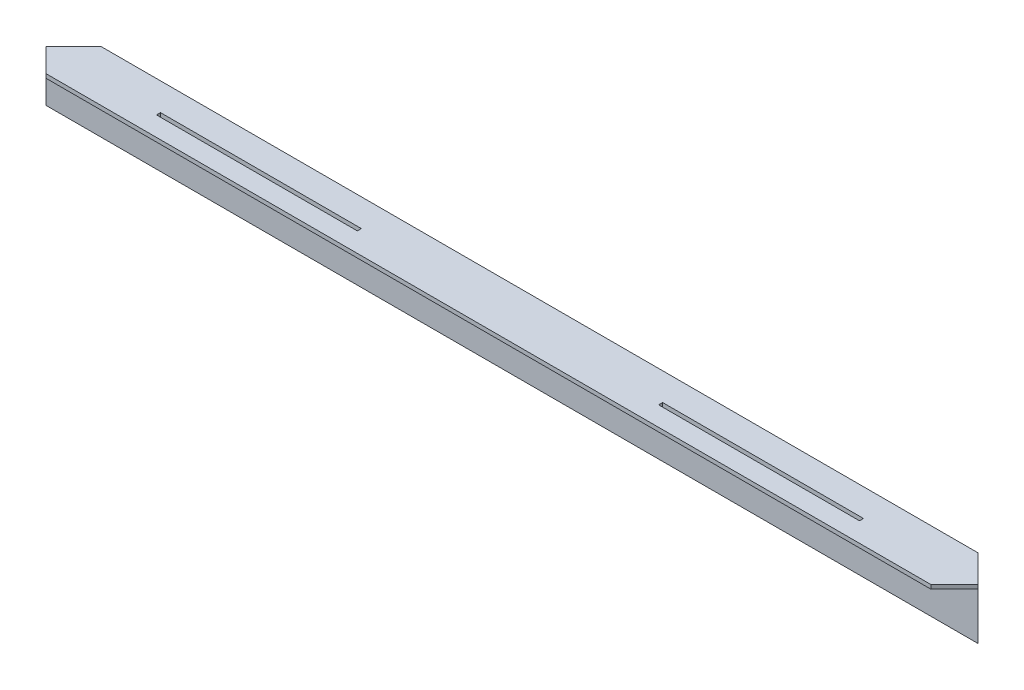
ISO-10303-21;
HEADER;
FILE_DESCRIPTION(('STEP AP214'),'2;1');
FILE_NAME('part.step','',(''),(''),'','','');
FILE_SCHEMA(('AUTOMOTIVE_DESIGN { 1 0 10303 214 1 1 1 1 }'));
ENDSEC;
DATA;
#1=APPLICATION_CONTEXT('core data for automotive mechanical design processes');
#2=APPLICATION_PROTOCOL_DEFINITION('international standard','automotive_design',2000,#1);
#3=PRODUCT_CONTEXT('',#1,'mechanical');
#4=PRODUCT('Part','Part','',(#3));
#5=PRODUCT_RELATED_PRODUCT_CATEGORY('part','',(#4));
#6=PRODUCT_DEFINITION_FORMATION('','',#4);
#7=PRODUCT_DEFINITION_CONTEXT('part definition',#1,'design');
#8=PRODUCT_DEFINITION('design','',#6,#7);
#9=PRODUCT_DEFINITION_SHAPE('','',#8);
#10=(LENGTH_UNIT() NAMED_UNIT(*) SI_UNIT(.MILLI.,.METRE.));
#11=(NAMED_UNIT(*) PLANE_ANGLE_UNIT() SI_UNIT($,.RADIAN.));
#12=(NAMED_UNIT(*) SI_UNIT($,.STERADIAN.) SOLID_ANGLE_UNIT());
#13=UNCERTAINTY_MEASURE_WITH_UNIT(LENGTH_MEASURE(1.E-05),#10,'distance_accuracy_value','');
#14=(GEOMETRIC_REPRESENTATION_CONTEXT(3) GLOBAL_UNCERTAINTY_ASSIGNED_CONTEXT((#13)) GLOBAL_UNIT_ASSIGNED_CONTEXT((#10,
#11,#12)) REPRESENTATION_CONTEXT('',''));
#15=CARTESIAN_POINT('',(0.,0.,0.));
#16=DIRECTION('',(0.,0.,1.));
#17=DIRECTION('',(1.,0.,0.));
#18=AXIS2_PLACEMENT_3D('',#15,#16,#17);
#19=CARTESIAN_POINT('',(232.,0.,168.3));
#20=DIRECTION('',(0.,0.,1.));
#21=DIRECTION('',(1.,0.,0.));
#22=AXIS2_PLACEMENT_3D('',#19,#20,#21);
#23=PLANE('',#22);
#24=DIRECTION('',(-1.,0.,0.));
#25=VECTOR('',#24,1.);
#26=CARTESIAN_POINT('',(232.,-2.,168.3));
#27=LINE('',#26,#25);
#28=CARTESIAN_POINT('',(218.3,-2.,168.3));
#29=VERTEX_POINT('',#28);
#30=CARTESIAN_POINT('',(-218.3,-2.,168.3));
#31=VERTEX_POINT('',#30);
#32=EDGE_CURVE('E191',#29,#31,#27,.T.);
#33=ORIENTED_EDGE('',*,*,#32,.T.);
#34=DIRECTION('',(0.,1.,0.));
#35=VECTOR('',#34,1.);
#36=CARTESIAN_POINT('',(-218.3,-50.,168.3));
#37=LINE('',#36,#35);
#38=CARTESIAN_POINT('',(-218.3,0.,168.3));
#39=VERTEX_POINT('',#38);
#40=EDGE_CURVE('E250',#31,#39,#37,.T.);
#41=ORIENTED_EDGE('',*,*,#40,.T.);
#42=DIRECTION('',(-1.,0.,0.));
#43=VECTOR('',#42,1.);
#44=CARTESIAN_POINT('',(232.,0.,168.3));
#45=LINE('',#44,#43);
#46=CARTESIAN_POINT('',(218.3,0.,168.3));
#47=VERTEX_POINT('',#46);
#48=EDGE_CURVE('E212',#47,#39,#45,.T.);
#49=ORIENTED_EDGE('',*,*,#48,.F.);
#50=DIRECTION('',(0.,1.,0.));
#51=VECTOR('',#50,1.);
#52=CARTESIAN_POINT('',(218.3,-50.,168.3));
#53=LINE('',#52,#51);
#54=EDGE_CURVE('E179',#29,#47,#53,.T.);
#55=ORIENTED_EDGE('',*,*,#54,.F.);
#56=EDGE_LOOP('',(#33,#41,#49,#55));
#57=FACE_BOUND('',#56,.T.);
#58=ADVANCED_FACE('F33',(#57),#23,.F.);
#59=CARTESIAN_POINT('',(232.,0.,193.7));
#60=DIRECTION('',(0.,-1.,0.));
#61=DIRECTION('',(0.,0.,-1.));
#62=AXIS2_PLACEMENT_3D('',#59,#60,#61);
#63=PLANE('',#62);
#64=DIRECTION('',(0.,0.,1.));
#65=VECTOR('',#64,1.);
#66=CARTESIAN_POINT('',(-175.,0.,182.));
#67=LINE('',#66,#65);
#68=CARTESIAN_POINT('',(-175.,0.,182.));
#69=VERTEX_POINT('',#68);
#70=CARTESIAN_POINT('',(-175.,0.,184.));
#71=VERTEX_POINT('',#70);
#72=EDGE_CURVE('E375',#69,#71,#67,.T.);
#73=ORIENTED_EDGE('',*,*,#72,.F.);
#74=DIRECTION('',(-1.,0.,0.));
#75=VECTOR('',#74,1.);
#76=CARTESIAN_POINT('',(-75.,0.,182.));
#77=LINE('',#76,#75);
#78=CARTESIAN_POINT('',(-75.,0.,182.));
#79=VERTEX_POINT('',#78);
#80=EDGE_CURVE('E47',#79,#69,#77,.T.);
#81=ORIENTED_EDGE('',*,*,#80,.F.);
#82=DIRECTION('',(0.,0.,-1.));
#83=VECTOR('',#82,1.);
#84=CARTESIAN_POINT('',(-75.,0.,182.));
#85=LINE('',#84,#83);
#86=CARTESIAN_POINT('',(-75.,0.,184.));
#87=VERTEX_POINT('',#86);
#88=EDGE_CURVE('E306',#87,#79,#85,.T.);
#89=ORIENTED_EDGE('',*,*,#88,.F.);
#90=DIRECTION('',(1.,0.,0.));
#91=VECTOR('',#90,1.);
#92=CARTESIAN_POINT('',(-175.,0.,184.));
#93=LINE('',#92,#91);
#94=EDGE_CURVE('E297',#71,#87,#93,.T.);
#95=ORIENTED_EDGE('',*,*,#94,.F.);
#96=EDGE_LOOP('',(#73,#81,#89,#95));
#97=FACE_BOUND('',#96,.T.);
#98=DIRECTION('',(1.,0.,0.));
#99=VECTOR('',#98,1.);
#100=CARTESIAN_POINT('',(175.,0.,184.));
#101=LINE('',#100,#99);
#102=CARTESIAN_POINT('',(75.,0.,184.));
#103=VERTEX_POINT('',#102);
#104=CARTESIAN_POINT('',(175.,0.,184.));
#105=VERTEX_POINT('',#104);
#106=EDGE_CURVE('E308',#103,#105,#101,.T.);
#107=ORIENTED_EDGE('',*,*,#106,.F.);
#108=DIRECTION('',(0.,0.,1.));
#109=VECTOR('',#108,1.);
#110=CARTESIAN_POINT('',(75.,0.,182.));
#111=LINE('',#110,#109);
#112=CARTESIAN_POINT('',(75.,0.,182.));
#113=VERTEX_POINT('',#112);
#114=EDGE_CURVE('E55',#113,#103,#111,.T.);
#115=ORIENTED_EDGE('',*,*,#114,.F.);
#116=DIRECTION('',(-1.,0.,0.));
#117=VECTOR('',#116,1.);
#118=CARTESIAN_POINT('',(75.,0.,182.));
#119=LINE('',#118,#117);
#120=CARTESIAN_POINT('',(175.,0.,182.));
#121=VERTEX_POINT('',#120);
#122=EDGE_CURVE('E232',#121,#113,#119,.T.);
#123=ORIENTED_EDGE('',*,*,#122,.F.);
#124=DIRECTION('',(0.,0.,-1.));
#125=VECTOR('',#124,1.);
#126=CARTESIAN_POINT('',(175.,0.,182.));
#127=LINE('',#126,#125);
#128=EDGE_CURVE('E237',#105,#121,#127,.T.);
#129=ORIENTED_EDGE('',*,*,#128,.F.);
#130=EDGE_LOOP('',(#107,#115,#123,#129));
#131=FACE_BOUND('',#130,.T.);
#132=DIRECTION('',(-0.707106781186548,0.,0.707106781186548));
#133=VECTOR('',#132,1.);
#134=CARTESIAN_POINT('',(-5.84999999999999,0.,-44.15));
#135=LINE('',#134,#133);
#136=CARTESIAN_POINT('',(-232.,0.,182.));
#137=VERTEX_POINT('',#136);
#138=EDGE_CURVE('E263',#39,#137,#135,.T.);
#139=ORIENTED_EDGE('',*,*,#138,.T.);
#140=DIRECTION('',(0.707106781186547,0.,0.707106781186547));
#141=VECTOR('',#140,1.);
#142=CARTESIAN_POINT('',(5.84999999999999,0.,419.85));
#143=LINE('',#142,#141);
#144=CARTESIAN_POINT('',(-220.3,0.,193.7));
#145=VERTEX_POINT('',#144);
#146=EDGE_CURVE('E309',#137,#145,#143,.T.);
#147=ORIENTED_EDGE('',*,*,#146,.T.);
#148=DIRECTION('',(-1.,0.,0.));
#149=VECTOR('',#148,1.);
#150=CARTESIAN_POINT('',(232.,0.,193.7));
#151=LINE('',#150,#149);
#152=CARTESIAN_POINT('',(220.3,0.,193.7));
#153=VERTEX_POINT('',#152);
#154=EDGE_CURVE('E174',#153,#145,#151,.T.);
#155=ORIENTED_EDGE('',*,*,#154,.F.);
#156=DIRECTION('',(0.707106781186546,0.,-0.707106781186549));
#157=VECTOR('',#156,1.);
#158=CARTESIAN_POINT('',(226.15,0.,187.85));
#159=LINE('',#158,#157);
#160=CARTESIAN_POINT('',(232.,0.,182.));
#161=VERTEX_POINT('',#160);
#162=EDGE_CURVE('E155',#153,#161,#159,.T.);
#163=ORIENTED_EDGE('',*,*,#162,.T.);
#164=DIRECTION('',(-0.707106781186548,0.,-0.707106781186548));
#165=VECTOR('',#164,1.);
#166=CARTESIAN_POINT('',(237.85,0.,187.85));
#167=LINE('',#166,#165);
#168=EDGE_CURVE('E170',#161,#47,#167,.T.);
#169=ORIENTED_EDGE('',*,*,#168,.T.);
#170=ORIENTED_EDGE('',*,*,#48,.T.);
#171=EDGE_LOOP('',(#139,#147,#155,#163,#169,#170));
#172=FACE_BOUND('',#171,.T.);
#173=ADVANCED_FACE('F168',(#97,#131,#172),#63,.F.);
#174=CARTESIAN_POINT('',(232.,0.,193.7));
#175=DIRECTION('',(0.,0.,-1.));
#176=DIRECTION('',(-1.,0.,0.));
#177=AXIS2_PLACEMENT_3D('',#174,#175,#176);
#178=PLANE('',#177);
#179=ORIENTED_EDGE('',*,*,#154,.T.);
#180=DIRECTION('',(0.,1.,0.));
#181=VECTOR('',#180,1.);
#182=CARTESIAN_POINT('',(-220.3,-50.,193.7));
#183=LINE('',#182,#181);
#184=CARTESIAN_POINT('',(-220.3,-2.,193.7));
#185=VERTEX_POINT('',#184);
#186=EDGE_CURVE('E379',#185,#145,#183,.T.);
#187=ORIENTED_EDGE('',*,*,#186,.F.);
#188=DIRECTION('',(-1.,0.,0.));
#189=VECTOR('',#188,1.);
#190=CARTESIAN_POINT('',(232.,-2.,193.7));
#191=LINE('',#190,#189);
#192=CARTESIAN_POINT('',(220.3,-2.,193.7));
#193=VERTEX_POINT('',#192);
#194=EDGE_CURVE('E207',#193,#185,#191,.T.);
#195=ORIENTED_EDGE('',*,*,#194,.F.);
#196=DIRECTION('',(0.,1.,0.));
#197=VECTOR('',#196,1.);
#198=CARTESIAN_POINT('',(220.3,-50.,193.7));
#199=LINE('',#198,#197);
#200=EDGE_CURVE('E380',#193,#153,#199,.T.);
#201=ORIENTED_EDGE('',*,*,#200,.T.);
#202=EDGE_LOOP('',(#179,#187,#195,#201));
#203=FACE_BOUND('',#202,.T.);
#204=ADVANCED_FACE('F319',(#203),#178,.F.);
#205=CARTESIAN_POINT('',(232.,-2.,193.7));
#206=DIRECTION('',(0.,1.,0.));
#207=DIRECTION('',(0.,0.,1.));
#208=AXIS2_PLACEMENT_3D('',#205,#206,#207);
#209=PLANE('',#208);
#210=ORIENTED_EDGE('',*,*,#194,.T.);
#211=DIRECTION('',(-0.707106781186548,0.,-0.707106781186548));
#212=VECTOR('',#211,1.);
#213=CARTESIAN_POINT('',(5.84999999999999,-2.,419.85));
#214=LINE('',#213,#212);
#215=CARTESIAN_POINT('',(-232.,-2.,182.));
#216=VERTEX_POINT('',#215);
#217=EDGE_CURVE('E175',#185,#216,#214,.T.);
#218=ORIENTED_EDGE('',*,*,#217,.T.);
#219=DIRECTION('',(-1.,0.,0.));
#220=VECTOR('',#219,1.);
#221=CARTESIAN_POINT('',(232.,-2.,182.));
#222=LINE('',#221,#220);
#223=CARTESIAN_POINT('',(-175.,-2.,182.));
#224=VERTEX_POINT('',#223);
#225=EDGE_CURVE('E203',#224,#216,#222,.T.);
#226=ORIENTED_EDGE('',*,*,#225,.F.);
#227=DIRECTION('',(0.,0.,1.));
#228=VECTOR('',#227,1.);
#229=CARTESIAN_POINT('',(-175.,-2.,193.7));
#230=LINE('',#229,#228);
#231=CARTESIAN_POINT('',(-175.,-2.,184.));
#232=VERTEX_POINT('',#231);
#233=EDGE_CURVE('E244',#224,#232,#230,.T.);
#234=ORIENTED_EDGE('',*,*,#233,.T.);
#235=DIRECTION('',(1.,0.,0.));
#236=VECTOR('',#235,1.);
#237=CARTESIAN_POINT('',(232.,-2.,184.));
#238=LINE('',#237,#236);
#239=CARTESIAN_POINT('',(-75.,-2.,184.));
#240=VERTEX_POINT('',#239);
#241=EDGE_CURVE('E11',#232,#240,#238,.T.);
#242=ORIENTED_EDGE('',*,*,#241,.T.);
#243=DIRECTION('',(0.,0.,-1.));
#244=VECTOR('',#243,1.);
#245=CARTESIAN_POINT('',(-75.,-2.,193.7));
#246=LINE('',#245,#244);
#247=CARTESIAN_POINT('',(-75.,-2.,182.));
#248=VERTEX_POINT('',#247);
#249=EDGE_CURVE('E247',#240,#248,#246,.T.);
#250=ORIENTED_EDGE('',*,*,#249,.T.);
#251=CARTESIAN_POINT('',(75.,-2.,182.));
#252=VERTEX_POINT('',#251);
#253=EDGE_CURVE('E208',#252,#248,#222,.T.);
#254=ORIENTED_EDGE('',*,*,#253,.F.);
#255=DIRECTION('',(0.,0.,1.));
#256=VECTOR('',#255,1.);
#257=CARTESIAN_POINT('',(75.,-2.,193.7));
#258=LINE('',#257,#256);
#259=CARTESIAN_POINT('',(75.,-2.,184.));
#260=VERTEX_POINT('',#259);
#261=EDGE_CURVE('E223',#252,#260,#258,.T.);
#262=ORIENTED_EDGE('',*,*,#261,.T.);
#263=DIRECTION('',(1.,0.,0.));
#264=VECTOR('',#263,1.);
#265=CARTESIAN_POINT('',(232.,-2.,184.));
#266=LINE('',#265,#264);
#267=CARTESIAN_POINT('',(175.,-2.,184.));
#268=VERTEX_POINT('',#267);
#269=EDGE_CURVE('E40',#260,#268,#266,.T.);
#270=ORIENTED_EDGE('',*,*,#269,.T.);
#271=DIRECTION('',(0.,0.,-1.));
#272=VECTOR('',#271,1.);
#273=CARTESIAN_POINT('',(175.,-2.,193.7));
#274=LINE('',#273,#272);
#275=CARTESIAN_POINT('',(175.,-2.,182.));
#276=VERTEX_POINT('',#275);
#277=EDGE_CURVE('E221',#268,#276,#274,.T.);
#278=ORIENTED_EDGE('',*,*,#277,.T.);
#279=CARTESIAN_POINT('',(232.,-2.,182.));
#280=VERTEX_POINT('',#279);
#281=EDGE_CURVE('E204',#280,#276,#222,.T.);
#282=ORIENTED_EDGE('',*,*,#281,.F.);
#283=DIRECTION('',(-0.707106781186546,0.,0.707106781186549));
#284=VECTOR('',#283,1.);
#285=CARTESIAN_POINT('',(226.15,-2.,187.85));
#286=LINE('',#285,#284);
#287=EDGE_CURVE('E158',#280,#193,#286,.T.);
#288=ORIENTED_EDGE('',*,*,#287,.T.);
#289=EDGE_LOOP('',(#210,#218,#226,#234,#242,#250,#254,#262,#270,#278,#282,#288));
#290=FACE_BOUND('',#289,.T.);
#291=ADVANCED_FACE('F219',(#290),#209,.F.);
#292=CARTESIAN_POINT('',(232.,-2.,182.));
#293=DIRECTION('',(0.,0.,-1.));
#294=DIRECTION('',(-1.,0.,0.));
#295=AXIS2_PLACEMENT_3D('',#292,#293,#294);
#296=PLANE('',#295);
#297=ORIENTED_EDGE('',*,*,#281,.T.);
#298=DIRECTION('',(0.,1.,0.));
#299=VECTOR('',#298,1.);
#300=CARTESIAN_POINT('',(175.,-25.4,182.));
#301=LINE('',#300,#299);
#302=EDGE_CURVE('E234',#276,#121,#301,.T.);
#303=ORIENTED_EDGE('',*,*,#302,.T.);
#304=ORIENTED_EDGE('',*,*,#122,.T.);
#305=DIRECTION('',(0.,1.,0.));
#306=VECTOR('',#305,1.);
#307=CARTESIAN_POINT('',(75.,-25.4,182.));
#308=LINE('',#307,#306);
#309=EDGE_CURVE('E287',#252,#113,#308,.T.);
#310=ORIENTED_EDGE('',*,*,#309,.F.);
#311=ORIENTED_EDGE('',*,*,#253,.T.);
#312=DIRECTION('',(0.,1.,0.));
#313=VECTOR('',#312,1.);
#314=CARTESIAN_POINT('',(-75.,-25.4,182.));
#315=LINE('',#314,#313);
#316=EDGE_CURVE('E242',#248,#79,#315,.T.);
#317=ORIENTED_EDGE('',*,*,#316,.T.);
#318=ORIENTED_EDGE('',*,*,#80,.T.);
#319=DIRECTION('',(0.,1.,0.));
#320=VECTOR('',#319,1.);
#321=CARTESIAN_POINT('',(-175.,-25.4,182.));
#322=LINE('',#321,#320);
#323=EDGE_CURVE('E283',#224,#69,#322,.T.);
#324=ORIENTED_EDGE('',*,*,#323,.F.);
#325=ORIENTED_EDGE('',*,*,#225,.T.);
#326=DIRECTION('',(0.,-1.,0.));
#327=VECTOR('',#326,1.);
#328=CARTESIAN_POINT('',(-232.,-2.,182.));
#329=LINE('',#328,#327);
#330=CARTESIAN_POINT('',(-232.,-25.4,182.));
#331=VERTEX_POINT('',#330);
#332=EDGE_CURVE('E180',#216,#331,#329,.T.);
#333=ORIENTED_EDGE('',*,*,#332,.T.);
#334=DIRECTION('',(-1.,0.,0.));
#335=VECTOR('',#334,1.);
#336=CARTESIAN_POINT('',(232.,-25.4,182.));
#337=LINE('',#336,#335);
#338=CARTESIAN_POINT('',(232.,-25.4,182.));
#339=VERTEX_POINT('',#338);
#340=EDGE_CURVE('E201',#339,#331,#337,.T.);
#341=ORIENTED_EDGE('',*,*,#340,.F.);
#342=DIRECTION('',(0.,-1.,0.));
#343=VECTOR('',#342,1.);
#344=CARTESIAN_POINT('',(232.,-2.,182.));
#345=LINE('',#344,#343);
#346=EDGE_CURVE('E184',#280,#339,#345,.T.);
#347=ORIENTED_EDGE('',*,*,#346,.F.);
#348=EDGE_LOOP('',(#297,#303,#304,#310,#311,#317,#318,#324,#325,#333,#341,#347));
#349=FACE_BOUND('',#348,.T.);
#350=ADVANCED_FACE('F280',(#349),#296,.F.);
#351=CARTESIAN_POINT('',(232.,-25.4,182.));
#352=DIRECTION('',(0.,1.,0.));
#353=DIRECTION('',(0.,0.,1.));
#354=AXIS2_PLACEMENT_3D('',#351,#352,#353);
#355=PLANE('',#354);
#356=ORIENTED_EDGE('',*,*,#340,.T.);
#357=DIRECTION('',(0.707106781186548,0.,-0.707106781186548));
#358=VECTOR('',#357,1.);
#359=CARTESIAN_POINT('',(0.,-25.4,-50.));
#360=LINE('',#359,#358);
#361=CARTESIAN_POINT('',(-230.,-25.4,180.));
#362=VERTEX_POINT('',#361);
#363=EDGE_CURVE('E260',#331,#362,#360,.T.);
#364=ORIENTED_EDGE('',*,*,#363,.T.);
#365=DIRECTION('',(-1.,0.,0.));
#366=VECTOR('',#365,1.);
#367=CARTESIAN_POINT('',(232.,-25.4,180.));
#368=LINE('',#367,#366);
#369=CARTESIAN_POINT('',(230.,-25.4,180.));
#370=VERTEX_POINT('',#369);
#371=EDGE_CURVE('E198',#370,#362,#368,.T.);
#372=ORIENTED_EDGE('',*,*,#371,.F.);
#373=DIRECTION('',(0.707106781186548,0.,0.707106781186548));
#374=VECTOR('',#373,1.);
#375=CARTESIAN_POINT('',(232.,-25.4,182.));
#376=LINE('',#375,#374);
#377=EDGE_CURVE('E181',#370,#339,#376,.T.);
#378=ORIENTED_EDGE('',*,*,#377,.T.);
#379=EDGE_LOOP('',(#356,#364,#372,#378));
#380=FACE_BOUND('',#379,.T.);
#381=ADVANCED_FACE('F273',(#380),#355,.F.);
#382=CARTESIAN_POINT('',(232.,-2.,180.));
#383=DIRECTION('',(0.,0.,1.));
#384=DIRECTION('',(1.,0.,0.));
#385=AXIS2_PLACEMENT_3D('',#382,#383,#384);
#386=PLANE('',#385);
#387=ORIENTED_EDGE('',*,*,#371,.T.);
#388=DIRECTION('',(0.,1.,0.));
#389=VECTOR('',#388,1.);
#390=CARTESIAN_POINT('',(-230.,-2.,180.));
#391=LINE('',#390,#389);
#392=CARTESIAN_POINT('',(-230.,-2.,180.));
#393=VERTEX_POINT('',#392);
#394=EDGE_CURVE('E257',#362,#393,#391,.T.);
#395=ORIENTED_EDGE('',*,*,#394,.T.);
#396=DIRECTION('',(-1.,0.,0.));
#397=VECTOR('',#396,1.);
#398=CARTESIAN_POINT('',(232.,-2.,180.));
#399=LINE('',#398,#397);
#400=CARTESIAN_POINT('',(230.,-2.,180.));
#401=VERTEX_POINT('',#400);
#402=EDGE_CURVE('E195',#401,#393,#399,.T.);
#403=ORIENTED_EDGE('',*,*,#402,.F.);
#404=DIRECTION('',(0.,-1.,0.));
#405=VECTOR('',#404,1.);
#406=CARTESIAN_POINT('',(230.,-2.,180.));
#407=LINE('',#406,#405);
#408=EDGE_CURVE('E187',#401,#370,#407,.T.);
#409=ORIENTED_EDGE('',*,*,#408,.T.);
#410=EDGE_LOOP('',(#387,#395,#403,#409));
#411=FACE_BOUND('',#410,.T.);
#412=ADVANCED_FACE('F271',(#411),#386,.F.);
#413=CARTESIAN_POINT('',(232.,-2.,168.3));
#414=DIRECTION('',(0.,1.,0.));
#415=DIRECTION('',(0.,0.,1.));
#416=AXIS2_PLACEMENT_3D('',#413,#414,#415);
#417=PLANE('',#416);
#418=ORIENTED_EDGE('',*,*,#402,.T.);
#419=DIRECTION('',(0.707106781186548,0.,-0.707106781186548));
#420=VECTOR('',#419,1.);
#421=CARTESIAN_POINT('',(6.85,-2.00000000000001,-56.85));
#422=LINE('',#421,#420);
#423=EDGE_CURVE('E253',#393,#31,#422,.T.);
#424=ORIENTED_EDGE('',*,*,#423,.T.);
#425=ORIENTED_EDGE('',*,*,#32,.F.);
#426=DIRECTION('',(0.707106781186548,0.,0.707106781186548));
#427=VECTOR('',#426,1.);
#428=CARTESIAN_POINT('',(225.15,-2.,175.15));
#429=LINE('',#428,#427);
#430=EDGE_CURVE('E265',#29,#401,#429,.T.);
#431=ORIENTED_EDGE('',*,*,#430,.T.);
#432=EDGE_LOOP('',(#418,#424,#425,#431));
#433=FACE_BOUND('',#432,.T.);
#434=ADVANCED_FACE('F339',(#433),#417,.F.);
#435=CARTESIAN_POINT('',(-232.,-50.,182.));
#436=DIRECTION('',(0.707106781186548,0.,0.707106781186548));
#437=DIRECTION('',(0.707106781186548,0.,-0.707106781186548));
#438=AXIS2_PLACEMENT_3D('',#435,#436,#437);
#439=PLANE('',#438);
#440=ORIENTED_EDGE('',*,*,#40,.F.);
#441=ORIENTED_EDGE('',*,*,#423,.F.);
#442=ORIENTED_EDGE('',*,*,#394,.F.);
#443=ORIENTED_EDGE('',*,*,#363,.F.);
#444=ORIENTED_EDGE('',*,*,#332,.F.);
#445=DIRECTION('',(0.,1.,0.));
#446=VECTOR('',#445,1.);
#447=CARTESIAN_POINT('',(-232.,0.,182.));
#448=LINE('',#447,#446);
#449=EDGE_CURVE('E162',#216,#137,#448,.T.);
#450=ORIENTED_EDGE('',*,*,#449,.T.);
#451=ORIENTED_EDGE('',*,*,#138,.F.);
#452=EDGE_LOOP('',(#440,#441,#442,#443,#444,#450,#451));
#453=FACE_BOUND('',#452,.T.);
#454=ADVANCED_FACE('F278',(#453),#439,.F.);
#455=CARTESIAN_POINT('',(232.,-50.,182.));
#456=DIRECTION('',(-0.707106781186548,0.,0.707106781186548));
#457=DIRECTION('',(0.707106781186548,0.,0.707106781186548));
#458=AXIS2_PLACEMENT_3D('',#455,#456,#457);
#459=PLANE('',#458);
#460=DIRECTION('',(0.,1.,0.));
#461=VECTOR('',#460,1.);
#462=CARTESIAN_POINT('',(232.,0.,182.));
#463=LINE('',#462,#461);
#464=EDGE_CURVE('E152',#280,#161,#463,.T.);
#465=ORIENTED_EDGE('',*,*,#464,.F.);
#466=ORIENTED_EDGE('',*,*,#346,.T.);
#467=ORIENTED_EDGE('',*,*,#377,.F.);
#468=ORIENTED_EDGE('',*,*,#408,.F.);
#469=ORIENTED_EDGE('',*,*,#430,.F.);
#470=ORIENTED_EDGE('',*,*,#54,.T.);
#471=ORIENTED_EDGE('',*,*,#168,.F.);
#472=EDGE_LOOP('',(#465,#466,#467,#468,#469,#470,#471));
#473=FACE_BOUND('',#472,.T.);
#474=ADVANCED_FACE('F177',(#473),#459,.F.);
#475=CARTESIAN_POINT('',(175.,-25.4,184.));
#476=DIRECTION('',(0.,0.,1.));
#477=DIRECTION('',(1.,0.,0.));
#478=AXIS2_PLACEMENT_3D('',#475,#476,#477);
#479=PLANE('',#478);
#480=DIRECTION('',(0.,1.,0.));
#481=VECTOR('',#480,1.);
#482=CARTESIAN_POINT('',(75.,-25.4,184.));
#483=LINE('',#482,#481);
#484=EDGE_CURVE('E227',#260,#103,#483,.T.);
#485=ORIENTED_EDGE('',*,*,#484,.T.);
#486=ORIENTED_EDGE('',*,*,#106,.T.);
#487=DIRECTION('',(0.,1.,0.));
#488=VECTOR('',#487,1.);
#489=CARTESIAN_POINT('',(175.,-25.4,184.));
#490=LINE('',#489,#488);
#491=EDGE_CURVE('E229',#268,#105,#490,.T.);
#492=ORIENTED_EDGE('',*,*,#491,.F.);
#493=ORIENTED_EDGE('',*,*,#269,.F.);
#494=EDGE_LOOP('',(#485,#486,#492,#493));
#495=FACE_BOUND('',#494,.T.);
#496=ADVANCED_FACE('F225',(#495),#479,.F.);
#497=CARTESIAN_POINT('',(75.,-25.4,182.));
#498=DIRECTION('',(-1.,0.,0.));
#499=DIRECTION('',(0.,0.,1.));
#500=AXIS2_PLACEMENT_3D('',#497,#498,#499);
#501=PLANE('',#500);
#502=ORIENTED_EDGE('',*,*,#309,.T.);
#503=ORIENTED_EDGE('',*,*,#114,.T.);
#504=ORIENTED_EDGE('',*,*,#484,.F.);
#505=ORIENTED_EDGE('',*,*,#261,.F.);
#506=EDGE_LOOP('',(#502,#503,#504,#505));
#507=FACE_BOUND('',#506,.T.);
#508=ADVANCED_FACE('F230',(#507),#501,.F.);
#509=CARTESIAN_POINT('',(175.,-25.4,182.));
#510=DIRECTION('',(1.,0.,0.));
#511=DIRECTION('',(0.,0.,-1.));
#512=AXIS2_PLACEMENT_3D('',#509,#510,#511);
#513=PLANE('',#512);
#514=ORIENTED_EDGE('',*,*,#491,.T.);
#515=ORIENTED_EDGE('',*,*,#128,.T.);
#516=ORIENTED_EDGE('',*,*,#302,.F.);
#517=ORIENTED_EDGE('',*,*,#277,.F.);
#518=EDGE_LOOP('',(#514,#515,#516,#517));
#519=FACE_BOUND('',#518,.T.);
#520=ADVANCED_FACE('F316',(#519),#513,.F.);
#521=CARTESIAN_POINT('',(-175.,-25.4,184.));
#522=DIRECTION('',(0.,0.,1.));
#523=DIRECTION('',(1.,0.,0.));
#524=AXIS2_PLACEMENT_3D('',#521,#522,#523);
#525=PLANE('',#524);
#526=DIRECTION('',(0.,1.,0.));
#527=VECTOR('',#526,1.);
#528=CARTESIAN_POINT('',(-175.,-25.4,184.));
#529=LINE('',#528,#527);
#530=EDGE_CURVE('E299',#232,#71,#529,.T.);
#531=ORIENTED_EDGE('',*,*,#530,.T.);
#532=ORIENTED_EDGE('',*,*,#94,.T.);
#533=DIRECTION('',(0.,1.,0.));
#534=VECTOR('',#533,1.);
#535=CARTESIAN_POINT('',(-75.,-25.4,184.));
#536=LINE('',#535,#534);
#537=EDGE_CURVE('E292',#240,#87,#536,.T.);
#538=ORIENTED_EDGE('',*,*,#537,.F.);
#539=ORIENTED_EDGE('',*,*,#241,.F.);
#540=EDGE_LOOP('',(#531,#532,#538,#539));
#541=FACE_BOUND('',#540,.T.);
#542=ADVANCED_FACE('F295',(#541),#525,.F.);
#543=CARTESIAN_POINT('',(-75.,-25.4,182.));
#544=DIRECTION('',(1.,0.,0.));
#545=DIRECTION('',(0.,0.,-1.));
#546=AXIS2_PLACEMENT_3D('',#543,#544,#545);
#547=PLANE('',#546);
#548=ORIENTED_EDGE('',*,*,#537,.T.);
#549=ORIENTED_EDGE('',*,*,#88,.T.);
#550=ORIENTED_EDGE('',*,*,#316,.F.);
#551=ORIENTED_EDGE('',*,*,#249,.F.);
#552=EDGE_LOOP('',(#548,#549,#550,#551));
#553=FACE_BOUND('',#552,.T.);
#554=ADVANCED_FACE('F291',(#553),#547,.F.);
#555=CARTESIAN_POINT('',(-175.,-25.4,182.));
#556=DIRECTION('',(-1.,0.,0.));
#557=DIRECTION('',(0.,0.,1.));
#558=AXIS2_PLACEMENT_3D('',#555,#556,#557);
#559=PLANE('',#558);
#560=ORIENTED_EDGE('',*,*,#323,.T.);
#561=ORIENTED_EDGE('',*,*,#72,.T.);
#562=ORIENTED_EDGE('',*,*,#530,.F.);
#563=ORIENTED_EDGE('',*,*,#233,.F.);
#564=EDGE_LOOP('',(#560,#561,#562,#563));
#565=FACE_BOUND('',#564,.T.);
#566=ADVANCED_FACE('F353',(#565),#559,.F.);
#567=CARTESIAN_POINT('',(232.,-50.,182.));
#568=DIRECTION('',(-0.707106781186549,0.,-0.707106781186546));
#569=DIRECTION('',(-0.707106781186546,0.,0.707106781186549));
#570=AXIS2_PLACEMENT_3D('',#567,#568,#569);
#571=PLANE('',#570);
#572=ORIENTED_EDGE('',*,*,#200,.F.);
#573=ORIENTED_EDGE('',*,*,#287,.F.);
#574=ORIENTED_EDGE('',*,*,#464,.T.);
#575=ORIENTED_EDGE('',*,*,#162,.F.);
#576=EDGE_LOOP('',(#572,#573,#574,#575));
#577=FACE_BOUND('',#576,.T.);
#578=ADVANCED_FACE('F154',(#577),#571,.F.);
#579=CARTESIAN_POINT('',(-232.,-50.,182.));
#580=DIRECTION('',(0.707106781186547,0.,-0.707106781186547));
#581=DIRECTION('',(-0.707106781186548,0.,-0.707106781186548));
#582=AXIS2_PLACEMENT_3D('',#579,#580,#581);
#583=PLANE('',#582);
#584=ORIENTED_EDGE('',*,*,#449,.F.);
#585=ORIENTED_EDGE('',*,*,#217,.F.);
#586=ORIENTED_EDGE('',*,*,#186,.T.);
#587=ORIENTED_EDGE('',*,*,#146,.F.);
#588=EDGE_LOOP('',(#584,#585,#586,#587));
#589=FACE_BOUND('',#588,.T.);
#590=ADVANCED_FACE('F363',(#589),#583,.F.);
#591=CLOSED_SHELL('',(#58,#173,#204,#291,#350,#381,#412,#434,#454,#474,#496,#508,#520,#542,#554,
#566,#578,#590));
#592=MANIFOLD_SOLID_BREP('B2',#591);
#593=ADVANCED_BREP_SHAPE_REPRESENTATION('',(#18,#592),#14);
#594=SHAPE_DEFINITION_REPRESENTATION(#9,#593);
ENDSEC;
END-ISO-10303-21;
